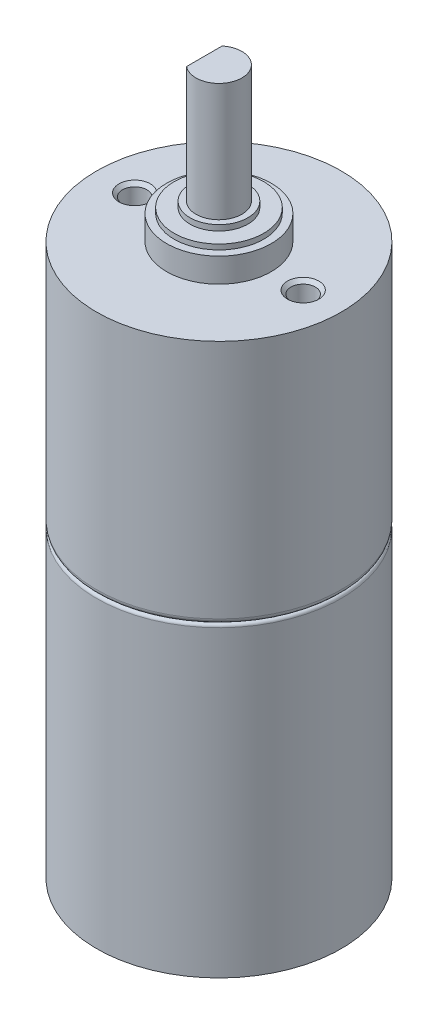
ISO-10303-21;
HEADER;
FILE_DESCRIPTION(('STEP AP214'),'2;1');
FILE_NAME('part.step','',(''),(''),'','','');
FILE_SCHEMA(('AUTOMOTIVE_DESIGN { 1 0 10303 214 1 1 1 1 }'));
ENDSEC;
DATA;
#1=APPLICATION_CONTEXT('core data for automotive mechanical design processes');
#2=APPLICATION_PROTOCOL_DEFINITION('international standard','automotive_design',2000,#1);
#3=PRODUCT_CONTEXT('',#1,'mechanical');
#4=PRODUCT('Part','Part','',(#3));
#5=PRODUCT_RELATED_PRODUCT_CATEGORY('part','',(#4));
#6=PRODUCT_DEFINITION_FORMATION('','',#4);
#7=PRODUCT_DEFINITION_CONTEXT('part definition',#1,'design');
#8=PRODUCT_DEFINITION('design','',#6,#7);
#9=PRODUCT_DEFINITION_SHAPE('','',#8);
#10=(LENGTH_UNIT() NAMED_UNIT(*) SI_UNIT(.MILLI.,.METRE.));
#11=(NAMED_UNIT(*) PLANE_ANGLE_UNIT() SI_UNIT($,.RADIAN.));
#12=(NAMED_UNIT(*) SI_UNIT($,.STERADIAN.) SOLID_ANGLE_UNIT());
#13=UNCERTAINTY_MEASURE_WITH_UNIT(LENGTH_MEASURE(1.E-05),#10,'distance_accuracy_value','');
#14=(GEOMETRIC_REPRESENTATION_CONTEXT(3) GLOBAL_UNCERTAINTY_ASSIGNED_CONTEXT((#13)) GLOBAL_UNIT_ASSIGNED_CONTEXT((#10,
#11,#12)) REPRESENTATION_CONTEXT('',''));
#15=CARTESIAN_POINT('',(0.,0.,0.));
#16=DIRECTION('',(0.,0.,1.));
#17=DIRECTION('',(1.,0.,0.));
#18=AXIS2_PLACEMENT_3D('',#15,#16,#17);
#19=CARTESIAN_POINT('',(0.,0.,0.));
#20=DIRECTION('',(0.,1.,0.));
#21=DIRECTION('',(-1.,0.,0.));
#22=AXIS2_PLACEMENT_3D('',#19,#20,#21);
#23=PLANE('',#22);
#24=CARTESIAN_POINT('',(0.,0.,0.));
#25=DIRECTION('',(0.,1.,0.));
#26=DIRECTION('',(-1.,0.,0.));
#27=AXIS2_PLACEMENT_3D('',#24,#25,#26);
#28=CIRCLE('',#27,2.71304200881028);
#29=CARTESIAN_POINT('',(-2.71304200881028,0.,0.));
#30=VERTEX_POINT('',#29);
#31=EDGE_CURVE('E11',#30,#30,#28,.T.);
#32=ORIENTED_EDGE('',*,*,#31,.F.);
#33=EDGE_LOOP('',(#32));
#34=FACE_BOUND('',#33,.T.);
#35=ADVANCED_FACE('F41',(#34),#23,.F.);
#36=CARTESIAN_POINT('',(0.,47.0578554612307,0.));
#37=DIRECTION('',(0.,1.,0.));
#38=DIRECTION('',(-1.,0.,0.));
#39=AXIS2_PLACEMENT_3D('',#36,#37,#38);
#40=CYLINDRICAL_SURFACE('',#39,2.71304200881028);
#41=CARTESIAN_POINT('',(0.,1.0578554612307,0.));
#42=DIRECTION('',(0.,1.,0.));
#43=DIRECTION('',(-1.,0.,0.));
#44=AXIS2_PLACEMENT_3D('',#41,#42,#43);
#45=CIRCLE('',#44,2.71304200881028);
#46=CARTESIAN_POINT('',(-2.71304200881028,1.0578554612307,0.));
#47=VERTEX_POINT('',#46);
#48=EDGE_CURVE('E48',#47,#47,#45,.T.);
#49=ORIENTED_EDGE('',*,*,#48,.F.);
#50=EDGE_LOOP('',(#49));
#51=FACE_BOUND('',#50,.T.);
#52=ORIENTED_EDGE('',*,*,#31,.T.);
#53=EDGE_LOOP('',(#52));
#54=FACE_BOUND('',#53,.T.);
#55=ADVANCED_FACE('F151',(#51,#54),#40,.T.);
#56=CARTESIAN_POINT('',(2.71304200881028,1.0578554612307,0.));
#57=DIRECTION('',(0.,1.,0.));
#58=DIRECTION('',(-1.,0.,0.));
#59=AXIS2_PLACEMENT_3D('',#56,#57,#58);
#60=PLANE('',#59);
#61=CARTESIAN_POINT('',(0.,1.0578554612307,0.));
#62=DIRECTION('',(0.,1.,0.));
#63=DIRECTION('',(-1.,0.,0.));
#64=AXIS2_PLACEMENT_3D('',#61,#62,#63);
#65=CIRCLE('',#64,7.98830000000001);
#66=CARTESIAN_POINT('',(-7.98830000000001,1.0578554612307,0.));
#67=VERTEX_POINT('',#66);
#68=EDGE_CURVE('E144',#67,#67,#65,.T.);
#69=ORIENTED_EDGE('',*,*,#68,.F.);
#70=EDGE_LOOP('',(#69));
#71=FACE_BOUND('',#70,.T.);
#72=ORIENTED_EDGE('',*,*,#48,.T.);
#73=EDGE_LOOP('',(#72));
#74=FACE_BOUND('',#73,.T.);
#75=ADVANCED_FACE('F149',(#71,#74),#60,.F.);
#76=CARTESIAN_POINT('',(0.,47.0578554612307,0.));
#77=DIRECTION('',(0.,1.,0.));
#78=DIRECTION('',(-1.,0.,0.));
#79=AXIS2_PLACEMENT_3D('',#76,#77,#78);
#80=CYLINDRICAL_SURFACE('',#79,7.98830000000001);
#81=CARTESIAN_POINT('',(0.,20.8634964669717,0.));
#82=DIRECTION('',(0.,1.,0.));
#83=DIRECTION('',(-1.,0.,0.));
#84=AXIS2_PLACEMENT_3D('',#81,#82,#83);
#85=CIRCLE('',#84,7.98830000000001);
#86=CARTESIAN_POINT('',(-7.98830000000001,20.8634964669717,0.));
#87=VERTEX_POINT('',#86);
#88=EDGE_CURVE('E141',#87,#87,#85,.T.);
#89=ORIENTED_EDGE('',*,*,#88,.F.);
#90=EDGE_LOOP('',(#89));
#91=FACE_BOUND('',#90,.T.);
#92=ORIENTED_EDGE('',*,*,#68,.T.);
#93=EDGE_LOOP('',(#92));
#94=FACE_BOUND('',#93,.T.);
#95=ADVANCED_FACE('F169',(#91,#94),#80,.T.);
#96=CARTESIAN_POINT('',(0.,20.8634964669717,0.));
#97=DIRECTION('',(0.,1.,0.));
#98=DIRECTION('',(-1.,0.,0.));
#99=AXIS2_PLACEMENT_3D('',#96,#97,#98);
#100=TOROIDAL_SURFACE('',#99,7.7931896094049,0.195110390595102);
#101=CARTESIAN_POINT('',(0.,21.0578554612307,0.));
#102=DIRECTION('',(0.,1.,0.));
#103=DIRECTION('',(-1.,0.,0.));
#104=AXIS2_PLACEMENT_3D('',#101,#102,#103);
#105=CIRCLE('',#104,7.81029650476377);
#106=CARTESIAN_POINT('',(-7.81029650476377,21.0578554612307,0.));
#107=VERTEX_POINT('',#106);
#108=EDGE_CURVE('E138',#107,#107,#105,.T.);
#109=ORIENTED_EDGE('',*,*,#108,.F.);
#110=EDGE_LOOP('',(#109));
#111=FACE_BOUND('',#110,.T.);
#112=ORIENTED_EDGE('',*,*,#88,.T.);
#113=EDGE_LOOP('',(#112));
#114=FACE_BOUND('',#113,.T.);
#115=ADVANCED_FACE('F177',(#111,#114),#100,.T.);
#116=CARTESIAN_POINT('',(0.,21.3623156291431,0.));
#117=DIRECTION('',(0.,1.,0.));
#118=DIRECTION('',(-1.,0.,0.));
#119=AXIS2_PLACEMENT_3D('',#116,#117,#118);
#120=TOROIDAL_SURFACE('',#119,7.6389213600005,0.349378639999503);
#121=CARTESIAN_POINT('',(0.,21.3623156291431,0.));
#122=DIRECTION('',(0.,1.,0.));
#123=DIRECTION('',(-1.,0.,0.));
#124=AXIS2_PLACEMENT_3D('',#121,#122,#123);
#125=CIRCLE('',#124,7.98830000000001);
#126=CARTESIAN_POINT('',(-7.98830000000001,21.3623156291431,0.));
#127=VERTEX_POINT('',#126);
#128=EDGE_CURVE('E135',#127,#127,#125,.T.);
#129=ORIENTED_EDGE('',*,*,#128,.F.);
#130=EDGE_LOOP('',(#129));
#131=FACE_BOUND('',#130,.T.);
#132=ORIENTED_EDGE('',*,*,#108,.T.);
#133=EDGE_LOOP('',(#132));
#134=FACE_BOUND('',#133,.T.);
#135=ADVANCED_FACE('F185',(#131,#134),#120,.T.);
#136=CARTESIAN_POINT('',(0.,47.0578554612307,0.));
#137=DIRECTION('',(0.,1.,0.));
#138=DIRECTION('',(-1.,0.,0.));
#139=AXIS2_PLACEMENT_3D('',#136,#137,#138);
#140=CYLINDRICAL_SURFACE('',#139,7.98830000000001);
#141=CARTESIAN_POINT('',(0.,37.0578554612307,0.));
#142=DIRECTION('',(0.,1.,0.));
#143=DIRECTION('',(-1.,0.,0.));
#144=AXIS2_PLACEMENT_3D('',#141,#142,#143);
#145=CIRCLE('',#144,7.98830000000001);
#146=CARTESIAN_POINT('',(-7.98830000000001,37.0578554612307,0.));
#147=VERTEX_POINT('',#146);
#148=EDGE_CURVE('E132',#147,#147,#145,.T.);
#149=ORIENTED_EDGE('',*,*,#148,.F.);
#150=EDGE_LOOP('',(#149));
#151=FACE_BOUND('',#150,.T.);
#152=ORIENTED_EDGE('',*,*,#128,.T.);
#153=EDGE_LOOP('',(#152));
#154=FACE_BOUND('',#153,.T.);
#155=ADVANCED_FACE('F193',(#151,#154),#140,.T.);
#156=CARTESIAN_POINT('',(7.98830000000001,37.0578554612307,0.));
#157=DIRECTION('',(0.,-1.,0.));
#158=DIRECTION('',(1.,0.,0.));
#159=AXIS2_PLACEMENT_3D('',#156,#157,#158);
#160=PLANE('',#159);
#161=CARTESIAN_POINT('',(-5.5,37.0578554612307,0.));
#162=DIRECTION('',(0.,1.,0.));
#163=DIRECTION('',(0.,0.,1.));
#164=AXIS2_PLACEMENT_3D('',#161,#162,#163);
#165=CIRCLE('',#164,1.025);
#166=CARTESIAN_POINT('',(-5.5,37.0578554612307,1.025));
#167=VERTEX_POINT('',#166);
#168=EDGE_CURVE('E89',#167,#167,#165,.T.);
#169=ORIENTED_EDGE('',*,*,#168,.F.);
#170=EDGE_LOOP('',(#169));
#171=FACE_BOUND('',#170,.T.);
#172=CARTESIAN_POINT('',(5.5,37.0578554612307,0.));
#173=DIRECTION('',(0.,1.,0.));
#174=DIRECTION('',(0.,0.,1.));
#175=AXIS2_PLACEMENT_3D('',#172,#173,#174);
#176=CIRCLE('',#175,1.025);
#177=CARTESIAN_POINT('',(5.5,37.0578554612307,1.025));
#178=VERTEX_POINT('',#177);
#179=EDGE_CURVE('E101',#178,#178,#176,.T.);
#180=ORIENTED_EDGE('',*,*,#179,.F.);
#181=EDGE_LOOP('',(#180));
#182=FACE_BOUND('',#181,.T.);
#183=CARTESIAN_POINT('',(0.,37.0578554612307,0.));
#184=DIRECTION('',(0.,1.,0.));
#185=DIRECTION('',(-1.,0.,0.));
#186=AXIS2_PLACEMENT_3D('',#183,#184,#185);
#187=CIRCLE('',#186,3.4163);
#188=CARTESIAN_POINT('',(-3.4163,37.0578554612307,0.));
#189=VERTEX_POINT('',#188);
#190=EDGE_CURVE('E129',#189,#189,#187,.T.);
#191=ORIENTED_EDGE('',*,*,#190,.F.);
#192=EDGE_LOOP('',(#191));
#193=FACE_BOUND('',#192,.T.);
#194=ORIENTED_EDGE('',*,*,#148,.T.);
#195=EDGE_LOOP('',(#194));
#196=FACE_BOUND('',#195,.T.);
#197=ADVANCED_FACE('F201',(#171,#182,#193,#196),#160,.F.);
#198=CARTESIAN_POINT('',(0.,47.0578554612307,0.));
#199=DIRECTION('',(0.,1.,0.));
#200=DIRECTION('',(-1.,0.,0.));
#201=AXIS2_PLACEMENT_3D('',#198,#199,#200);
#202=CYLINDRICAL_SURFACE('',#201,3.4163);
#203=CARTESIAN_POINT('',(0.,38.6463981901884,0.));
#204=DIRECTION('',(0.,1.,0.));
#205=DIRECTION('',(-1.,0.,0.));
#206=AXIS2_PLACEMENT_3D('',#203,#204,#205);
#207=CIRCLE('',#206,3.4163);
#208=CARTESIAN_POINT('',(-3.4163,38.6463981901884,0.));
#209=VERTEX_POINT('',#208);
#210=EDGE_CURVE('E126',#209,#209,#207,.T.);
#211=ORIENTED_EDGE('',*,*,#210,.F.);
#212=EDGE_LOOP('',(#211));
#213=FACE_BOUND('',#212,.T.);
#214=ORIENTED_EDGE('',*,*,#190,.T.);
#215=EDGE_LOOP('',(#214));
#216=FACE_BOUND('',#215,.T.);
#217=ADVANCED_FACE('F210',(#213,#216),#202,.T.);
#218=CARTESIAN_POINT('',(3.4163,38.6463981901884,0.));
#219=DIRECTION('',(0.,-1.,0.));
#220=DIRECTION('',(1.,0.,0.));
#221=AXIS2_PLACEMENT_3D('',#218,#219,#220);
#222=PLANE('',#221);
#223=CARTESIAN_POINT('',(0.,38.6463981901884,0.));
#224=DIRECTION('',(0.,1.,0.));
#225=DIRECTION('',(-1.,0.,0.));
#226=AXIS2_PLACEMENT_3D('',#223,#224,#225);
#227=CIRCLE('',#226,2.92486389388605);
#228=CARTESIAN_POINT('',(-2.92486389388605,38.6463981901884,0.));
#229=VERTEX_POINT('',#228);
#230=EDGE_CURVE('E123',#229,#229,#227,.T.);
#231=ORIENTED_EDGE('',*,*,#230,.F.);
#232=EDGE_LOOP('',(#231));
#233=FACE_BOUND('',#232,.T.);
#234=ORIENTED_EDGE('',*,*,#210,.T.);
#235=EDGE_LOOP('',(#234));
#236=FACE_BOUND('',#235,.T.);
#237=ADVANCED_FACE('F219',(#233,#236),#222,.F.);
#238=CARTESIAN_POINT('',(0.,47.0578554612307,0.));
#239=DIRECTION('',(0.,1.,0.));
#240=DIRECTION('',(-1.,0.,0.));
#241=AXIS2_PLACEMENT_3D('',#238,#239,#240);
#242=CYLINDRICAL_SURFACE('',#241,2.92486389388605);
#243=CARTESIAN_POINT('',(0.,38.982086399138,0.));
#244=DIRECTION('',(0.,1.,0.));
#245=DIRECTION('',(-1.,0.,0.));
#246=AXIS2_PLACEMENT_3D('',#243,#244,#245);
#247=CIRCLE('',#246,2.92486389388605);
#248=CARTESIAN_POINT('',(-2.92486389388605,38.982086399138,0.));
#249=VERTEX_POINT('',#248);
#250=EDGE_CURVE('E120',#249,#249,#247,.T.);
#251=ORIENTED_EDGE('',*,*,#250,.F.);
#252=EDGE_LOOP('',(#251));
#253=FACE_BOUND('',#252,.T.);
#254=ORIENTED_EDGE('',*,*,#230,.T.);
#255=EDGE_LOOP('',(#254));
#256=FACE_BOUND('',#255,.T.);
#257=ADVANCED_FACE('F227',(#253,#256),#242,.T.);
#258=CARTESIAN_POINT('',(2.92486389388605,38.982086399138,0.));
#259=DIRECTION('',(0.,-1.,0.));
#260=DIRECTION('',(1.,0.,0.));
#261=AXIS2_PLACEMENT_3D('',#258,#259,#260);
#262=PLANE('',#261);
#263=CARTESIAN_POINT('',(0.,38.982086399138,0.));
#264=DIRECTION('',(0.,1.,0.));
#265=DIRECTION('',(-1.,0.,0.));
#266=AXIS2_PLACEMENT_3D('',#263,#264,#265);
#267=CIRCLE('',#266,1.8885992437871);
#268=CARTESIAN_POINT('',(-1.8885992437871,38.982086399138,0.));
#269=VERTEX_POINT('',#268);
#270=EDGE_CURVE('E117',#269,#269,#267,.T.);
#271=ORIENTED_EDGE('',*,*,#270,.F.);
#272=EDGE_LOOP('',(#271));
#273=FACE_BOUND('',#272,.T.);
#274=ORIENTED_EDGE('',*,*,#250,.T.);
#275=EDGE_LOOP('',(#274));
#276=FACE_BOUND('',#275,.T.);
#277=ADVANCED_FACE('F235',(#273,#276),#262,.F.);
#278=CARTESIAN_POINT('',(0.,47.0578554612307,0.));
#279=DIRECTION('',(0.,1.,0.));
#280=DIRECTION('',(-1.,0.,0.));
#281=AXIS2_PLACEMENT_3D('',#278,#279,#280);
#282=CYLINDRICAL_SURFACE('',#281,1.8885992437871);
#283=CARTESIAN_POINT('',(0.,39.3463981901884,0.));
#284=DIRECTION('',(0.,1.,0.));
#285=DIRECTION('',(-1.,0.,0.));
#286=AXIS2_PLACEMENT_3D('',#283,#284,#285);
#287=CIRCLE('',#286,1.8885992437871);
#288=CARTESIAN_POINT('',(-1.8885992437871,39.3463981901884,0.));
#289=VERTEX_POINT('',#288);
#290=EDGE_CURVE('E114',#289,#289,#287,.T.);
#291=ORIENTED_EDGE('',*,*,#290,.F.);
#292=EDGE_LOOP('',(#291));
#293=FACE_BOUND('',#292,.T.);
#294=ORIENTED_EDGE('',*,*,#270,.T.);
#295=EDGE_LOOP('',(#294));
#296=FACE_BOUND('',#295,.T.);
#297=ADVANCED_FACE('F243',(#293,#296),#282,.T.);
#298=CARTESIAN_POINT('',(1.8885992437871,39.3463981901884,0.));
#299=DIRECTION('',(0.,-1.,0.));
#300=DIRECTION('',(1.,0.,0.));
#301=AXIS2_PLACEMENT_3D('',#298,#299,#300);
#302=PLANE('',#301);
#303=CARTESIAN_POINT('',(0.,39.3463981901884,0.));
#304=DIRECTION('',(0.,1.,0.));
#305=DIRECTION('',(-1.,0.,0.));
#306=AXIS2_PLACEMENT_3D('',#303,#304,#305);
#307=CIRCLE('',#306,1.5);
#308=CARTESIAN_POINT('',(-1.5,39.3463981901884,0.));
#309=VERTEX_POINT('',#308);
#310=EDGE_CURVE('E111',#309,#309,#307,.T.);
#311=ORIENTED_EDGE('',*,*,#310,.F.);
#312=EDGE_LOOP('',(#311));
#313=FACE_BOUND('',#312,.T.);
#314=ORIENTED_EDGE('',*,*,#290,.T.);
#315=EDGE_LOOP('',(#314));
#316=FACE_BOUND('',#315,.T.);
#317=ADVANCED_FACE('F251',(#313,#316),#302,.F.);
#318=CARTESIAN_POINT('',(0.,47.0578554612307,0.));
#319=DIRECTION('',(0.,1.,0.));
#320=DIRECTION('',(-1.,0.,0.));
#321=AXIS2_PLACEMENT_3D('',#318,#319,#320);
#322=CYLINDRICAL_SURFACE('',#321,1.5);
#323=CARTESIAN_POINT('',(0.,42.0413554612307,0.));
#324=DIRECTION('',(0.,1.,0.));
#325=DIRECTION('',(0.,0.,1.));
#326=AXIS2_PLACEMENT_3D('',#323,#324,#325);
#327=CIRCLE('',#326,1.5);
#328=CARTESIAN_POINT('',(-0.952499999999999,42.0413554612307,-1.15876820374051));
#329=VERTEX_POINT('',#328);
#330=CARTESIAN_POINT('',(-0.952499999999999,42.0413554612307,1.15876820374051));
#331=VERTEX_POINT('',#330);
#332=EDGE_CURVE('E73',#329,#331,#327,.T.);
#333=ORIENTED_EDGE('',*,*,#332,.F.);
#334=DIRECTION('',(0.,1.,0.));
#335=VECTOR('',#334,1.);
#336=CARTESIAN_POINT('',(-0.952499999999999,42.0413554612307,-1.15876820374051));
#337=LINE('',#336,#335);
#338=CARTESIAN_POINT('',(-0.952499999999999,47.0578554612307,-1.15876820374051));
#339=VERTEX_POINT('',#338);
#340=EDGE_CURVE('E81',#329,#339,#337,.T.);
#341=ORIENTED_EDGE('',*,*,#340,.T.);
#342=CARTESIAN_POINT('',(0.,47.0578554612307,0.));
#343=DIRECTION('',(0.,1.,0.));
#344=DIRECTION('',(-1.,0.,0.));
#345=AXIS2_PLACEMENT_3D('',#342,#343,#344);
#346=CIRCLE('',#345,1.5);
#347=CARTESIAN_POINT('',(-0.952499999999999,47.0578554612307,1.15876820374051));
#348=VERTEX_POINT('',#347);
#349=EDGE_CURVE('E87',#348,#339,#346,.T.);
#350=ORIENTED_EDGE('',*,*,#349,.F.);
#351=DIRECTION('',(0.,1.,0.));
#352=VECTOR('',#351,1.);
#353=CARTESIAN_POINT('',(-0.952499999999999,42.0413554612307,1.15876820374051));
#354=LINE('',#353,#352);
#355=EDGE_CURVE('E55',#331,#348,#354,.T.);
#356=ORIENTED_EDGE('',*,*,#355,.F.);
#357=EDGE_LOOP('',(#333,#341,#350,#356));
#358=FACE_BOUND('',#357,.T.);
#359=ORIENTED_EDGE('',*,*,#310,.T.);
#360=EDGE_LOOP('',(#359));
#361=FACE_BOUND('',#360,.T.);
#362=ADVANCED_FACE('F84',(#358,#361),#322,.T.);
#363=CARTESIAN_POINT('',(1.5,47.0578554612307,0.));
#364=DIRECTION('',(0.,-1.,0.));
#365=DIRECTION('',(1.,0.,0.));
#366=AXIS2_PLACEMENT_3D('',#363,#364,#365);
#367=PLANE('',#366);
#368=ORIENTED_EDGE('',*,*,#349,.T.);
#369=DIRECTION('',(0.,0.,-1.));
#370=VECTOR('',#369,1.);
#371=CARTESIAN_POINT('',(-0.952499999999999,47.0578554612307,0.));
#372=LINE('',#371,#370);
#373=EDGE_CURVE('E78',#348,#339,#372,.T.);
#374=ORIENTED_EDGE('',*,*,#373,.F.);
#375=EDGE_LOOP('',(#368,#374));
#376=FACE_BOUND('',#375,.T.);
#377=ADVANCED_FACE('F265',(#376),#367,.F.);
#378=CARTESIAN_POINT('',(5.5,25.0578540612307,0.));
#379=DIRECTION('',(0.,1.,0.));
#380=DIRECTION('',(0.,0.,1.));
#381=AXIS2_PLACEMENT_3D('',#378,#379,#380);
#382=CONICAL_SURFACE('',#381,0.799999999999988,1.02974425867665);
#383=CARTESIAN_POINT('',(5.5,24.5771655660087,0.));
#384=VERTEX_POINT('',#383);
#385=VERTEX_LOOP('',#384);
#386=FACE_BOUND('',#385,.T.);
#387=CARTESIAN_POINT('',(5.5,25.0578540612307,0.));
#388=DIRECTION('',(0.,1.,0.));
#389=DIRECTION('',(0.,0.,1.));
#390=AXIS2_PLACEMENT_3D('',#387,#388,#389);
#391=CIRCLE('',#390,0.799999999999988);
#392=CARTESIAN_POINT('',(5.5,25.0578540612307,0.799999999999988));
#393=VERTEX_POINT('',#392);
#394=EDGE_CURVE('E107',#393,#393,#391,.T.);
#395=ORIENTED_EDGE('',*,*,#394,.T.);
#396=EDGE_LOOP('',(#395));
#397=FACE_BOUND('',#396,.T.);
#398=ADVANCED_FACE('F273',(#386,#397),#382,.F.);
#399=CARTESIAN_POINT('',(5.5,37.0578554612307,0.));
#400=DIRECTION('',(0.,1.,0.));
#401=DIRECTION('',(0.,0.,1.));
#402=AXIS2_PLACEMENT_3D('',#399,#400,#401);
#403=CYLINDRICAL_SURFACE('',#402,0.799999999999993);
#404=ORIENTED_EDGE('',*,*,#394,.F.);
#405=EDGE_LOOP('',(#404));
#406=FACE_BOUND('',#405,.T.);
#407=CARTESIAN_POINT('',(5.5,36.8328554612307,0.));
#408=DIRECTION('',(0.,1.,0.));
#409=DIRECTION('',(0.,0.,1.));
#410=AXIS2_PLACEMENT_3D('',#407,#408,#409);
#411=CIRCLE('',#410,0.799999999999999);
#412=CARTESIAN_POINT('',(5.5,36.8328554612307,0.799999999999998));
#413=VERTEX_POINT('',#412);
#414=EDGE_CURVE('E104',#413,#413,#411,.T.);
#415=ORIENTED_EDGE('',*,*,#414,.T.);
#416=EDGE_LOOP('',(#415));
#417=FACE_BOUND('',#416,.T.);
#418=ADVANCED_FACE('F281',(#406,#417),#403,.F.);
#419=CARTESIAN_POINT('',(5.5,37.0578554612307,0.));
#420=DIRECTION('',(0.,1.,0.));
#421=DIRECTION('',(0.,0.,1.));
#422=AXIS2_PLACEMENT_3D('',#419,#420,#421);
#423=CONICAL_SURFACE('',#422,1.025,0.785398163397445);
#424=ORIENTED_EDGE('',*,*,#414,.F.);
#425=EDGE_LOOP('',(#424));
#426=FACE_BOUND('',#425,.T.);
#427=ORIENTED_EDGE('',*,*,#179,.T.);
#428=EDGE_LOOP('',(#427));
#429=FACE_BOUND('',#428,.T.);
#430=ADVANCED_FACE('F289',(#426,#429),#423,.F.);
#431=CARTESIAN_POINT('',(-5.5,25.0578540612307,0.));
#432=DIRECTION('',(0.,1.,0.));
#433=DIRECTION('',(0.,0.,1.));
#434=AXIS2_PLACEMENT_3D('',#431,#432,#433);
#435=CONICAL_SURFACE('',#434,0.799999999999988,1.02974425867665);
#436=CARTESIAN_POINT('',(-5.5,24.5771655660087,0.));
#437=VERTEX_POINT('',#436);
#438=VERTEX_LOOP('',#437);
#439=FACE_BOUND('',#438,.T.);
#440=CARTESIAN_POINT('',(-5.5,25.0578540612307,0.));
#441=DIRECTION('',(0.,1.,0.));
#442=DIRECTION('',(0.,0.,1.));
#443=AXIS2_PLACEMENT_3D('',#440,#441,#442);
#444=CIRCLE('',#443,0.799999999999988);
#445=CARTESIAN_POINT('',(-5.5,25.0578540612307,0.799999999999989));
#446=VERTEX_POINT('',#445);
#447=EDGE_CURVE('E98',#446,#446,#444,.T.);
#448=ORIENTED_EDGE('',*,*,#447,.T.);
#449=EDGE_LOOP('',(#448));
#450=FACE_BOUND('',#449,.T.);
#451=ADVANCED_FACE('F298',(#439,#450),#435,.F.);
#452=CARTESIAN_POINT('',(-5.5,37.0578554612307,0.));
#453=DIRECTION('',(0.,1.,0.));
#454=DIRECTION('',(0.,0.,1.));
#455=AXIS2_PLACEMENT_3D('',#452,#453,#454);
#456=CYLINDRICAL_SURFACE('',#455,0.799999999999993);
#457=ORIENTED_EDGE('',*,*,#447,.F.);
#458=EDGE_LOOP('',(#457));
#459=FACE_BOUND('',#458,.T.);
#460=CARTESIAN_POINT('',(-5.5,36.8328554612307,0.));
#461=DIRECTION('',(0.,1.,0.));
#462=DIRECTION('',(0.,0.,1.));
#463=AXIS2_PLACEMENT_3D('',#460,#461,#462);
#464=CIRCLE('',#463,0.799999999999999);
#465=CARTESIAN_POINT('',(-5.5,36.8328554612307,0.799999999999999));
#466=VERTEX_POINT('',#465);
#467=EDGE_CURVE('E95',#466,#466,#464,.T.);
#468=ORIENTED_EDGE('',*,*,#467,.T.);
#469=EDGE_LOOP('',(#468));
#470=FACE_BOUND('',#469,.T.);
#471=ADVANCED_FACE('F306',(#459,#470),#456,.F.);
#472=CARTESIAN_POINT('',(-5.5,37.0578554612307,0.));
#473=DIRECTION('',(0.,1.,0.));
#474=DIRECTION('',(0.,0.,1.));
#475=AXIS2_PLACEMENT_3D('',#472,#473,#474);
#476=CONICAL_SURFACE('',#475,1.025,0.785398163397445);
#477=ORIENTED_EDGE('',*,*,#467,.F.);
#478=EDGE_LOOP('',(#477));
#479=FACE_BOUND('',#478,.T.);
#480=ORIENTED_EDGE('',*,*,#168,.T.);
#481=EDGE_LOOP('',(#480));
#482=FACE_BOUND('',#481,.T.);
#483=ADVANCED_FACE('F314',(#479,#482),#476,.F.);
#484=CARTESIAN_POINT('',(-0.952499999999999,42.0413554612307,0.));
#485=DIRECTION('',(1.,0.,0.));
#486=DIRECTION('',(0.,1.,0.));
#487=AXIS2_PLACEMENT_3D('',#484,#485,#486);
#488=PLANE('',#487);
#489=ORIENTED_EDGE('',*,*,#373,.T.);
#490=ORIENTED_EDGE('',*,*,#340,.F.);
#491=DIRECTION('',(0.,0.,-1.));
#492=VECTOR('',#491,1.);
#493=CARTESIAN_POINT('',(-0.952499999999999,42.0413554612307,0.));
#494=LINE('',#493,#492);
#495=EDGE_CURVE('E75',#331,#329,#494,.T.);
#496=ORIENTED_EDGE('',*,*,#495,.F.);
#497=ORIENTED_EDGE('',*,*,#355,.T.);
#498=EDGE_LOOP('',(#489,#490,#496,#497));
#499=FACE_BOUND('',#498,.T.);
#500=ADVANCED_FACE('F80',(#499),#488,.F.);
#501=CARTESIAN_POINT('',(0.,42.0413554612307,0.));
#502=DIRECTION('',(0.,1.,0.));
#503=DIRECTION('',(0.,0.,1.));
#504=AXIS2_PLACEMENT_3D('',#501,#502,#503);
#505=PLANE('',#504);
#506=ORIENTED_EDGE('',*,*,#332,.T.);
#507=ORIENTED_EDGE('',*,*,#495,.T.);
#508=EDGE_LOOP('',(#506,#507));
#509=FACE_BOUND('',#508,.T.);
#510=ADVANCED_FACE('F74',(#509),#505,.T.);
#511=CLOSED_SHELL('',(#35,#55,#75,#95,#115,#135,#155,#197,#217,#237,#257,#277,#297,#317,#362,
#377,#398,#418,#430,#451,#471,#483,#500,#510));
#512=MANIFOLD_SOLID_BREP('B2',#511);
#513=ADVANCED_BREP_SHAPE_REPRESENTATION('',(#18,#512),#14);
#514=SHAPE_DEFINITION_REPRESENTATION(#9,#513);
ENDSEC;
END-ISO-10303-21;
